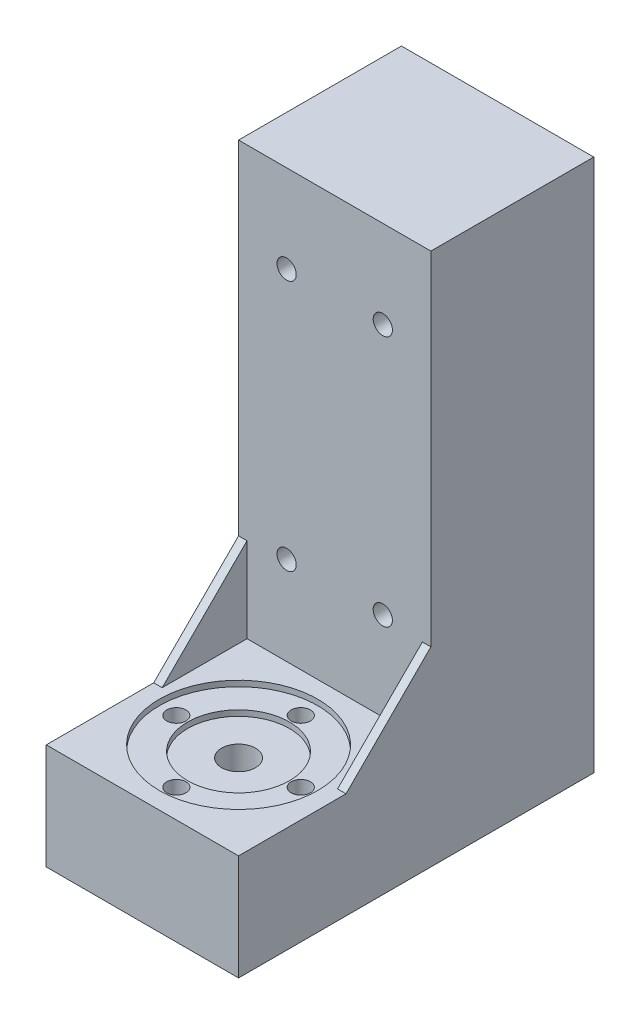
ISO-10303-21;
HEADER;
FILE_DESCRIPTION(('STEP AP214'),'2;1');
FILE_NAME('part.step','',(''),(''),'','','');
FILE_SCHEMA(('AUTOMOTIVE_DESIGN { 1 0 10303 214 1 1 1 1 }'));
ENDSEC;
DATA;
#1=APPLICATION_CONTEXT('core data for automotive mechanical design processes');
#2=APPLICATION_PROTOCOL_DEFINITION('international standard','automotive_design',2000,#1);
#3=PRODUCT_CONTEXT('',#1,'mechanical');
#4=PRODUCT('Part','Part','',(#3));
#5=PRODUCT_RELATED_PRODUCT_CATEGORY('part','',(#4));
#6=PRODUCT_DEFINITION_FORMATION('','',#4);
#7=PRODUCT_DEFINITION_CONTEXT('part definition',#1,'design');
#8=PRODUCT_DEFINITION('design','',#6,#7);
#9=PRODUCT_DEFINITION_SHAPE('','',#8);
#10=(LENGTH_UNIT() NAMED_UNIT(*) SI_UNIT(.MILLI.,.METRE.));
#11=(NAMED_UNIT(*) PLANE_ANGLE_UNIT() SI_UNIT($,.RADIAN.));
#12=(NAMED_UNIT(*) SI_UNIT($,.STERADIAN.) SOLID_ANGLE_UNIT());
#13=UNCERTAINTY_MEASURE_WITH_UNIT(LENGTH_MEASURE(1.E-05),#10,'distance_accuracy_value','');
#14=(GEOMETRIC_REPRESENTATION_CONTEXT(3) GLOBAL_UNCERTAINTY_ASSIGNED_CONTEXT((#13)) GLOBAL_UNIT_ASSIGNED_CONTEXT((#10,
#11,#12)) REPRESENTATION_CONTEXT('',''));
#15=CARTESIAN_POINT('',(0.,0.,0.));
#16=DIRECTION('',(0.,0.,1.));
#17=DIRECTION('',(1.,0.,0.));
#18=AXIS2_PLACEMENT_3D('',#15,#16,#17);
#19=CARTESIAN_POINT('',(-15.5,33.7,-34.));
#20=DIRECTION('',(0.,0.,-1.));
#21=DIRECTION('',(0.,1.,0.));
#22=AXIS2_PLACEMENT_3D('',#19,#20,#21);
#23=PLANE('',#22);
#24=DIRECTION('',(0.,-1.,0.));
#25=VECTOR('',#24,1.);
#26=CARTESIAN_POINT('',(-17.,33.7,-34.));
#27=LINE('',#26,#25);
#28=CARTESIAN_POINT('',(-17.,33.7,-34.));
#29=VERTEX_POINT('',#28);
#30=CARTESIAN_POINT('',(-17.,18.7,-34.));
#31=VERTEX_POINT('',#30);
#32=EDGE_CURVE('E110',#29,#31,#27,.T.);
#33=ORIENTED_EDGE('',*,*,#32,.F.);
#34=DIRECTION('',(-1.,0.,0.));
#35=VECTOR('',#34,1.);
#36=CARTESIAN_POINT('',(-15.5,33.7,-34.));
#37=LINE('',#36,#35);
#38=CARTESIAN_POINT('',(-15.5,33.7,-34.));
#39=VERTEX_POINT('',#38);
#40=EDGE_CURVE('E12',#39,#29,#37,.T.);
#41=ORIENTED_EDGE('',*,*,#40,.F.);
#42=DIRECTION('',(0.,-1.,0.));
#43=VECTOR('',#42,1.);
#44=CARTESIAN_POINT('',(-15.5,33.7,-34.));
#45=LINE('',#44,#43);
#46=CARTESIAN_POINT('',(-15.5,18.7,-34.));
#47=VERTEX_POINT('',#46);
#48=EDGE_CURVE('E97',#39,#47,#45,.T.);
#49=ORIENTED_EDGE('',*,*,#48,.T.);
#50=DIRECTION('',(-1.,0.,0.));
#51=VECTOR('',#50,1.);
#52=CARTESIAN_POINT('',(-15.5,18.7,-34.));
#53=LINE('',#52,#51);
#54=EDGE_CURVE('E59',#47,#31,#53,.T.);
#55=ORIENTED_EDGE('',*,*,#54,.T.);
#56=EDGE_LOOP('',(#33,#41,#49,#55));
#57=FACE_BOUND('',#56,.T.);
#58=ADVANCED_FACE('F54',(#57),#23,.T.);
#59=CARTESIAN_POINT('',(-15.5,18.7,-19.));
#60=DIRECTION('',(0.,0.707106781186547,0.707106781186548));
#61=DIRECTION('',(0.,-0.707106781186548,0.707106781186547));
#62=AXIS2_PLACEMENT_3D('',#59,#60,#61);
#63=PLANE('',#62);
#64=DIRECTION('',(0.,0.707106781186548,-0.707106781186547));
#65=VECTOR('',#64,1.);
#66=CARTESIAN_POINT('',(-17.,18.7,-19.));
#67=LINE('',#66,#65);
#68=CARTESIAN_POINT('',(-17.,18.7,-19.));
#69=VERTEX_POINT('',#68);
#70=EDGE_CURVE('E101',#69,#29,#67,.T.);
#71=ORIENTED_EDGE('',*,*,#70,.F.);
#72=DIRECTION('',(-1.,0.,0.));
#73=VECTOR('',#72,1.);
#74=CARTESIAN_POINT('',(-15.5,18.7,-19.));
#75=LINE('',#74,#73);
#76=CARTESIAN_POINT('',(-15.5,18.7,-19.));
#77=VERTEX_POINT('',#76);
#78=EDGE_CURVE('E62',#77,#69,#75,.T.);
#79=ORIENTED_EDGE('',*,*,#78,.F.);
#80=DIRECTION('',(0.,0.707106781186548,-0.707106781186547));
#81=VECTOR('',#80,1.);
#82=CARTESIAN_POINT('',(-15.5,18.7,-19.));
#83=LINE('',#82,#81);
#84=EDGE_CURVE('E96',#77,#39,#83,.T.);
#85=ORIENTED_EDGE('',*,*,#84,.T.);
#86=ORIENTED_EDGE('',*,*,#40,.T.);
#87=EDGE_LOOP('',(#71,#79,#85,#86));
#88=FACE_BOUND('',#87,.T.);
#89=ADVANCED_FACE('F112',(#88),#63,.T.);
#90=CARTESIAN_POINT('',(-15.5,18.7,-34.));
#91=DIRECTION('',(0.,-1.,0.));
#92=DIRECTION('',(0.,0.,-1.));
#93=AXIS2_PLACEMENT_3D('',#90,#91,#92);
#94=PLANE('',#93);
#95=DIRECTION('',(0.,0.,1.));
#96=VECTOR('',#95,1.);
#97=CARTESIAN_POINT('',(-17.,18.7,-34.));
#98=LINE('',#97,#96);
#99=EDGE_CURVE('E94',#31,#69,#98,.T.);
#100=ORIENTED_EDGE('',*,*,#99,.F.);
#101=ORIENTED_EDGE('',*,*,#54,.F.);
#102=DIRECTION('',(0.,0.,1.));
#103=VECTOR('',#102,1.);
#104=CARTESIAN_POINT('',(-15.5,18.7,-34.));
#105=LINE('',#104,#103);
#106=EDGE_CURVE('E95',#47,#77,#105,.T.);
#107=ORIENTED_EDGE('',*,*,#106,.T.);
#108=ORIENTED_EDGE('',*,*,#78,.T.);
#109=EDGE_LOOP('',(#100,#101,#107,#108));
#110=FACE_BOUND('',#109,.T.);
#111=ADVANCED_FACE('F93',(#110),#94,.T.);
#112=CARTESIAN_POINT('',(-15.5,0.,0.));
#113=DIRECTION('',(-1.,0.,0.));
#114=DIRECTION('',(0.,0.,1.));
#115=AXIS2_PLACEMENT_3D('',#112,#113,#114);
#116=PLANE('',#115);
#117=ORIENTED_EDGE('',*,*,#48,.F.);
#118=ORIENTED_EDGE('',*,*,#84,.F.);
#119=ORIENTED_EDGE('',*,*,#106,.F.);
#120=EDGE_LOOP('',(#117,#118,#119));
#121=FACE_BOUND('',#120,.T.);
#122=ADVANCED_FACE('F98',(#121),#116,.F.);
#123=CARTESIAN_POINT('',(-17.,0.,0.));
#124=DIRECTION('',(-1.,0.,0.));
#125=DIRECTION('',(0.,0.,1.));
#126=AXIS2_PLACEMENT_3D('',#123,#124,#125);
#127=PLANE('',#126);
#128=ORIENTED_EDGE('',*,*,#32,.T.);
#129=ORIENTED_EDGE('',*,*,#99,.T.);
#130=ORIENTED_EDGE('',*,*,#70,.T.);
#131=EDGE_LOOP('',(#128,#129,#130));
#132=FACE_BOUND('',#131,.T.);
#133=ADVANCED_FACE('F109',(#132),#127,.T.);
#134=CLOSED_SHELL('',(#58,#89,#111,#122,#133));
#135=MANIFOLD_SOLID_BREP('B2',#134);
#136=CARTESIAN_POINT('',(17.,18.7,-34.));
#137=DIRECTION('',(0.,-1.,0.));
#138=DIRECTION('',(0.,0.,-1.));
#139=AXIS2_PLACEMENT_3D('',#136,#137,#138);
#140=PLANE('',#139);
#141=CARTESIAN_POINT('',(0.,18.7,-17.));
#142=DIRECTION('',(0.,1.,0.));
#143=DIRECTION('',(0.,0.,1.));
#144=AXIS2_PLACEMENT_3D('',#141,#142,#143);
#145=CIRCLE('',#144,14.);
#146=CARTESIAN_POINT('',(0.,18.7,-2.99999999999999));
#147=VERTEX_POINT('',#146);
#148=EDGE_CURVE('E290',#147,#147,#145,.T.);
#149=ORIENTED_EDGE('',*,*,#148,.F.);
#150=EDGE_LOOP('',(#149));
#151=FACE_BOUND('',#150,.T.);
#152=DIRECTION('',(1.,0.,0.));
#153=VECTOR('',#152,1.);
#154=CARTESIAN_POINT('',(15.5,18.7,-19.));
#155=LINE('',#154,#153);
#156=CARTESIAN_POINT('',(15.5,18.7,-19.));
#157=VERTEX_POINT('',#156);
#158=CARTESIAN_POINT('',(17.,18.7,-19.));
#159=VERTEX_POINT('',#158);
#160=EDGE_CURVE('E367',#157,#159,#155,.T.);
#161=ORIENTED_EDGE('',*,*,#160,.F.);
#162=DIRECTION('',(0.,0.,-1.));
#163=VECTOR('',#162,1.);
#164=CARTESIAN_POINT('',(15.5,18.7,-19.));
#165=LINE('',#164,#163);
#166=CARTESIAN_POINT('',(15.5,18.7,-34.));
#167=VERTEX_POINT('',#166);
#168=EDGE_CURVE('E373',#157,#167,#165,.T.);
#169=ORIENTED_EDGE('',*,*,#168,.T.);
#170=DIRECTION('',(-1.,0.,0.));
#171=VECTOR('',#170,1.);
#172=CARTESIAN_POINT('',(17.,18.7,-34.));
#173=LINE('',#172,#171);
#174=CARTESIAN_POINT('',(-17.,18.7,-34.));
#175=VERTEX_POINT('',#174);
#176=EDGE_CURVE('E279',#167,#175,#173,.T.);
#177=ORIENTED_EDGE('',*,*,#176,.T.);
#178=DIRECTION('',(0.,0.,1.));
#179=VECTOR('',#178,1.);
#180=CARTESIAN_POINT('',(-17.,18.7,-34.));
#181=LINE('',#180,#179);
#182=CARTESIAN_POINT('',(-17.,18.7,0.));
#183=VERTEX_POINT('',#182);
#184=EDGE_CURVE('E210',#175,#183,#181,.T.);
#185=ORIENTED_EDGE('',*,*,#184,.T.);
#186=DIRECTION('',(-1.,0.,0.));
#187=VECTOR('',#186,1.);
#188=CARTESIAN_POINT('',(17.,18.7,0.));
#189=LINE('',#188,#187);
#190=CARTESIAN_POINT('',(17.,18.7,0.));
#191=VERTEX_POINT('',#190);
#192=EDGE_CURVE('E254',#191,#183,#189,.T.);
#193=ORIENTED_EDGE('',*,*,#192,.F.);
#194=DIRECTION('',(0.,0.,1.));
#195=VECTOR('',#194,1.);
#196=CARTESIAN_POINT('',(17.,18.7,-34.));
#197=LINE('',#196,#195);
#198=EDGE_CURVE('E179',#159,#191,#197,.T.);
#199=ORIENTED_EDGE('',*,*,#198,.F.);
#200=EDGE_LOOP('',(#161,#169,#177,#185,#193,#199));
#201=FACE_BOUND('',#200,.T.);
#202=ADVANCED_FACE('F153',(#151,#201),#140,.F.);
#203=CARTESIAN_POINT('',(17.,18.7,0.));
#204=DIRECTION('',(0.,0.,-1.));
#205=DIRECTION('',(-1.,0.,0.));
#206=AXIS2_PLACEMENT_3D('',#203,#204,#205);
#207=PLANE('',#206);
#208=DIRECTION('',(0.,-1.,0.));
#209=VECTOR('',#208,1.);
#210=CARTESIAN_POINT('',(-17.,18.7,0.));
#211=LINE('',#210,#209);
#212=CARTESIAN_POINT('',(-17.,0.,0.));
#213=VERTEX_POINT('',#212);
#214=EDGE_CURVE('E258',#183,#213,#211,.T.);
#215=ORIENTED_EDGE('',*,*,#214,.T.);
#216=DIRECTION('',(-1.,0.,0.));
#217=VECTOR('',#216,1.);
#218=CARTESIAN_POINT('',(17.,0.,0.));
#219=LINE('',#218,#217);
#220=CARTESIAN_POINT('',(17.,0.,0.));
#221=VERTEX_POINT('',#220);
#222=EDGE_CURVE('E52',#221,#213,#219,.T.);
#223=ORIENTED_EDGE('',*,*,#222,.F.);
#224=DIRECTION('',(0.,-1.,0.));
#225=VECTOR('',#224,1.);
#226=CARTESIAN_POINT('',(17.,18.7,0.));
#227=LINE('',#226,#225);
#228=EDGE_CURVE('E274',#191,#221,#227,.T.);
#229=ORIENTED_EDGE('',*,*,#228,.F.);
#230=ORIENTED_EDGE('',*,*,#192,.T.);
#231=EDGE_LOOP('',(#215,#223,#229,#230));
#232=FACE_BOUND('',#231,.T.);
#233=ADVANCED_FACE('F154',(#232),#207,.F.);
#234=CARTESIAN_POINT('',(17.,0.,0.));
#235=DIRECTION('',(0.,1.,0.));
#236=DIRECTION('',(0.,0.,1.));
#237=AXIS2_PLACEMENT_3D('',#234,#235,#236);
#238=PLANE('',#237);
#239=CARTESIAN_POINT('',(0.,0.,-6.00000000000001));
#240=DIRECTION('',(0.,1.,0.));
#241=DIRECTION('',(0.,0.,1.));
#242=AXIS2_PLACEMENT_3D('',#239,#240,#241);
#243=CIRCLE('',#242,1.7);
#244=CARTESIAN_POINT('',(0.,0.,-4.30000000000001));
#245=VERTEX_POINT('',#244);
#246=EDGE_CURVE('E305',#245,#245,#243,.T.);
#247=ORIENTED_EDGE('',*,*,#246,.T.);
#248=EDGE_LOOP('',(#247));
#249=FACE_BOUND('',#248,.T.);
#250=CARTESIAN_POINT('',(0.,0.,-17.));
#251=DIRECTION('',(0.,1.,0.));
#252=DIRECTION('',(0.,0.,1.));
#253=AXIS2_PLACEMENT_3D('',#250,#251,#252);
#254=CIRCLE('',#253,3.);
#255=CARTESIAN_POINT('',(0.,0.,-14.));
#256=VERTEX_POINT('',#255);
#257=EDGE_CURVE('E383',#256,#256,#254,.T.);
#258=ORIENTED_EDGE('',*,*,#257,.T.);
#259=EDGE_LOOP('',(#258));
#260=FACE_BOUND('',#259,.T.);
#261=CARTESIAN_POINT('',(-11.,0.,-17.));
#262=DIRECTION('',(0.,1.,0.));
#263=DIRECTION('',(0.,0.,1.));
#264=AXIS2_PLACEMENT_3D('',#261,#262,#263);
#265=CIRCLE('',#264,1.7);
#266=CARTESIAN_POINT('',(-11.,0.,-15.3));
#267=VERTEX_POINT('',#266);
#268=EDGE_CURVE('E397',#267,#267,#265,.T.);
#269=ORIENTED_EDGE('',*,*,#268,.T.);
#270=EDGE_LOOP('',(#269));
#271=FACE_BOUND('',#270,.T.);
#272=CARTESIAN_POINT('',(11.,0.,-17.));
#273=DIRECTION('',(0.,1.,0.));
#274=DIRECTION('',(0.,0.,1.));
#275=AXIS2_PLACEMENT_3D('',#272,#273,#274);
#276=CIRCLE('',#275,1.7);
#277=CARTESIAN_POINT('',(11.,0.,-15.3));
#278=VERTEX_POINT('',#277);
#279=EDGE_CURVE('E304',#278,#278,#276,.T.);
#280=ORIENTED_EDGE('',*,*,#279,.T.);
#281=EDGE_LOOP('',(#280));
#282=FACE_BOUND('',#281,.T.);
#283=CARTESIAN_POINT('',(0.,0.,-28.));
#284=DIRECTION('',(0.,1.,0.));
#285=DIRECTION('',(0.,0.,1.));
#286=AXIS2_PLACEMENT_3D('',#283,#284,#285);
#287=CIRCLE('',#286,1.7);
#288=CARTESIAN_POINT('',(0.,0.,-26.3));
#289=VERTEX_POINT('',#288);
#290=EDGE_CURVE('E406',#289,#289,#287,.T.);
#291=ORIENTED_EDGE('',*,*,#290,.T.);
#292=EDGE_LOOP('',(#291));
#293=FACE_BOUND('',#292,.T.);
#294=DIRECTION('',(0.,0.,-1.));
#295=VECTOR('',#294,1.);
#296=CARTESIAN_POINT('',(-17.,0.,0.));
#297=LINE('',#296,#295);
#298=CARTESIAN_POINT('',(-17.,0.,-62.8));
#299=VERTEX_POINT('',#298);
#300=EDGE_CURVE('E257',#213,#299,#297,.T.);
#301=ORIENTED_EDGE('',*,*,#300,.T.);
#302=DIRECTION('',(-1.,0.,0.));
#303=VECTOR('',#302,1.);
#304=CARTESIAN_POINT('',(17.,0.,-62.8));
#305=LINE('',#304,#303);
#306=CARTESIAN_POINT('',(17.,0.,-62.8));
#307=VERTEX_POINT('',#306);
#308=EDGE_CURVE('E162',#307,#299,#305,.T.);
#309=ORIENTED_EDGE('',*,*,#308,.F.);
#310=DIRECTION('',(0.,0.,-1.));
#311=VECTOR('',#310,1.);
#312=CARTESIAN_POINT('',(17.,0.,0.));
#313=LINE('',#312,#311);
#314=EDGE_CURVE('E214',#221,#307,#313,.T.);
#315=ORIENTED_EDGE('',*,*,#314,.F.);
#316=ORIENTED_EDGE('',*,*,#222,.T.);
#317=EDGE_LOOP('',(#301,#309,#315,#316));
#318=FACE_BOUND('',#317,.T.);
#319=ADVANCED_FACE('F350',(#249,#260,#271,#282,#293,#318),#238,.F.);
#320=CARTESIAN_POINT('',(17.,0.,-62.8));
#321=DIRECTION('',(0.,0.,1.));
#322=DIRECTION('',(1.,0.,0.));
#323=AXIS2_PLACEMENT_3D('',#320,#321,#322);
#324=PLANE('',#323);
#325=CARTESIAN_POINT('',(8.5,78.8,-62.8));
#326=DIRECTION('',(0.,0.,1.));
#327=DIRECTION('',(1.,0.,0.));
#328=AXIS2_PLACEMENT_3D('',#325,#326,#327);
#329=CIRCLE('',#328,1.7);
#330=CARTESIAN_POINT('',(10.2,78.8,-62.8));
#331=VERTEX_POINT('',#330);
#332=EDGE_CURVE('E322',#331,#331,#329,.T.);
#333=ORIENTED_EDGE('',*,*,#332,.T.);
#334=EDGE_LOOP('',(#333));
#335=FACE_BOUND('',#334,.T.);
#336=CARTESIAN_POINT('',(-8.49999999999999,34.35,-62.8));
#337=DIRECTION('',(0.,0.,1.));
#338=DIRECTION('',(-1.,0.,0.));
#339=AXIS2_PLACEMENT_3D('',#336,#337,#338);
#340=CIRCLE('',#339,1.7);
#341=CARTESIAN_POINT('',(-10.2,34.35,-62.8));
#342=VERTEX_POINT('',#341);
#343=EDGE_CURVE('E312',#342,#342,#340,.T.);
#344=ORIENTED_EDGE('',*,*,#343,.T.);
#345=EDGE_LOOP('',(#344));
#346=FACE_BOUND('',#345,.T.);
#347=CARTESIAN_POINT('',(-8.49999999999997,78.8,-62.8));
#348=DIRECTION('',(0.,0.,1.));
#349=DIRECTION('',(-1.,0.,0.));
#350=AXIS2_PLACEMENT_3D('',#347,#348,#349);
#351=CIRCLE('',#350,1.7);
#352=CARTESIAN_POINT('',(-10.2,78.8,-62.8));
#353=VERTEX_POINT('',#352);
#354=EDGE_CURVE('E310',#353,#353,#351,.T.);
#355=ORIENTED_EDGE('',*,*,#354,.T.);
#356=EDGE_LOOP('',(#355));
#357=FACE_BOUND('',#356,.T.);
#358=CARTESIAN_POINT('',(8.5,34.35,-62.8));
#359=DIRECTION('',(0.,0.,1.));
#360=DIRECTION('',(1.,0.,0.));
#361=AXIS2_PLACEMENT_3D('',#358,#359,#360);
#362=CIRCLE('',#361,1.7);
#363=CARTESIAN_POINT('',(10.2,34.35,-62.8));
#364=VERTEX_POINT('',#363);
#365=EDGE_CURVE('E261',#364,#364,#362,.T.);
#366=ORIENTED_EDGE('',*,*,#365,.T.);
#367=EDGE_LOOP('',(#366));
#368=FACE_BOUND('',#367,.T.);
#369=DIRECTION('',(0.,1.,0.));
#370=VECTOR('',#369,1.);
#371=CARTESIAN_POINT('',(-17.,0.,-62.8));
#372=LINE('',#371,#370);
#373=CARTESIAN_POINT('',(-17.,94.3,-62.8));
#374=VERTEX_POINT('',#373);
#375=EDGE_CURVE('E240',#299,#374,#372,.T.);
#376=ORIENTED_EDGE('',*,*,#375,.T.);
#377=DIRECTION('',(-1.,0.,0.));
#378=VECTOR('',#377,1.);
#379=CARTESIAN_POINT('',(17.,94.3,-62.8));
#380=LINE('',#379,#378);
#381=CARTESIAN_POINT('',(17.,94.3,-62.8));
#382=VERTEX_POINT('',#381);
#383=EDGE_CURVE('E233',#382,#374,#380,.T.);
#384=ORIENTED_EDGE('',*,*,#383,.F.);
#385=DIRECTION('',(0.,1.,0.));
#386=VECTOR('',#385,1.);
#387=CARTESIAN_POINT('',(17.,0.,-62.8));
#388=LINE('',#387,#386);
#389=EDGE_CURVE('E225',#307,#382,#388,.T.);
#390=ORIENTED_EDGE('',*,*,#389,.F.);
#391=ORIENTED_EDGE('',*,*,#308,.T.);
#392=EDGE_LOOP('',(#376,#384,#390,#391));
#393=FACE_BOUND('',#392,.T.);
#394=ADVANCED_FACE('F234',(#335,#346,#357,#368,#393),#324,.F.);
#395=CARTESIAN_POINT('',(17.,94.3,-62.8));
#396=DIRECTION('',(0.,-1.,0.));
#397=DIRECTION('',(0.,0.,-1.));
#398=AXIS2_PLACEMENT_3D('',#395,#396,#397);
#399=PLANE('',#398);
#400=DIRECTION('',(0.,0.,1.));
#401=VECTOR('',#400,1.);
#402=CARTESIAN_POINT('',(-17.,94.3,-62.8));
#403=LINE('',#402,#401);
#404=CARTESIAN_POINT('',(-17.,94.3,-34.));
#405=VERTEX_POINT('',#404);
#406=EDGE_CURVE('E266',#374,#405,#403,.T.);
#407=ORIENTED_EDGE('',*,*,#406,.T.);
#408=DIRECTION('',(-1.,0.,0.));
#409=VECTOR('',#408,1.);
#410=CARTESIAN_POINT('',(17.,94.3,-34.));
#411=LINE('',#410,#409);
#412=CARTESIAN_POINT('',(17.,94.3,-34.));
#413=VERTEX_POINT('',#412);
#414=EDGE_CURVE('E243',#413,#405,#411,.T.);
#415=ORIENTED_EDGE('',*,*,#414,.F.);
#416=DIRECTION('',(0.,0.,1.));
#417=VECTOR('',#416,1.);
#418=CARTESIAN_POINT('',(17.,94.3,-62.8));
#419=LINE('',#418,#417);
#420=EDGE_CURVE('E230',#382,#413,#419,.T.);
#421=ORIENTED_EDGE('',*,*,#420,.F.);
#422=ORIENTED_EDGE('',*,*,#383,.T.);
#423=EDGE_LOOP('',(#407,#415,#421,#422));
#424=FACE_BOUND('',#423,.T.);
#425=ADVANCED_FACE('F241',(#424),#399,.F.);
#426=CARTESIAN_POINT('',(17.,94.3,-34.));
#427=DIRECTION('',(0.,0.,-1.));
#428=DIRECTION('',(0.,1.,0.));
#429=AXIS2_PLACEMENT_3D('',#426,#427,#428);
#430=PLANE('',#429);
#431=CARTESIAN_POINT('',(8.5,78.8,-34.));
#432=DIRECTION('',(0.,0.,1.));
#433=DIRECTION('',(1.,0.,0.));
#434=AXIS2_PLACEMENT_3D('',#431,#432,#433);
#435=CIRCLE('',#434,1.7);
#436=CARTESIAN_POINT('',(10.2,78.8,-34.));
#437=VERTEX_POINT('',#436);
#438=EDGE_CURVE('E317',#437,#437,#435,.T.);
#439=ORIENTED_EDGE('',*,*,#438,.F.);
#440=EDGE_LOOP('',(#439));
#441=FACE_BOUND('',#440,.T.);
#442=CARTESIAN_POINT('',(-8.49999999999999,34.35,-34.));
#443=DIRECTION('',(0.,0.,1.));
#444=DIRECTION('',(-1.,0.,0.));
#445=AXIS2_PLACEMENT_3D('',#442,#443,#444);
#446=CIRCLE('',#445,1.7);
#447=CARTESIAN_POINT('',(-10.2,34.35,-34.));
#448=VERTEX_POINT('',#447);
#449=EDGE_CURVE('E327',#448,#448,#446,.T.);
#450=ORIENTED_EDGE('',*,*,#449,.F.);
#451=EDGE_LOOP('',(#450));
#452=FACE_BOUND('',#451,.T.);
#453=CARTESIAN_POINT('',(-8.49999999999997,78.8,-34.));
#454=DIRECTION('',(0.,0.,1.));
#455=DIRECTION('',(-1.,0.,0.));
#456=AXIS2_PLACEMENT_3D('',#453,#454,#455);
#457=CIRCLE('',#456,1.7);
#458=CARTESIAN_POINT('',(-10.2,78.8,-34.));
#459=VERTEX_POINT('',#458);
#460=EDGE_CURVE('E313',#459,#459,#457,.T.);
#461=ORIENTED_EDGE('',*,*,#460,.F.);
#462=EDGE_LOOP('',(#461));
#463=FACE_BOUND('',#462,.T.);
#464=CARTESIAN_POINT('',(8.5,34.35,-34.));
#465=DIRECTION('',(0.,0.,1.));
#466=DIRECTION('',(1.,0.,0.));
#467=AXIS2_PLACEMENT_3D('',#464,#465,#466);
#468=CIRCLE('',#467,1.7);
#469=CARTESIAN_POINT('',(10.2,34.35,-34.));
#470=VERTEX_POINT('',#469);
#471=EDGE_CURVE('E323',#470,#470,#468,.T.);
#472=ORIENTED_EDGE('',*,*,#471,.F.);
#473=EDGE_LOOP('',(#472));
#474=FACE_BOUND('',#473,.T.);
#475=ORIENTED_EDGE('',*,*,#176,.F.);
#476=DIRECTION('',(0.,1.,0.));
#477=VECTOR('',#476,1.);
#478=CARTESIAN_POINT('',(15.5,18.7,-34.));
#479=LINE('',#478,#477);
#480=CARTESIAN_POINT('',(15.5,33.7,-34.));
#481=VERTEX_POINT('',#480);
#482=EDGE_CURVE('E173',#167,#481,#479,.T.);
#483=ORIENTED_EDGE('',*,*,#482,.T.);
#484=DIRECTION('',(1.,0.,0.));
#485=VECTOR('',#484,1.);
#486=CARTESIAN_POINT('',(15.5,33.7,-34.));
#487=LINE('',#486,#485);
#488=CARTESIAN_POINT('',(17.,33.7,-34.));
#489=VERTEX_POINT('',#488);
#490=EDGE_CURVE('E360',#481,#489,#487,.T.);
#491=ORIENTED_EDGE('',*,*,#490,.T.);
#492=DIRECTION('',(0.,-1.,0.));
#493=VECTOR('',#492,1.);
#494=CARTESIAN_POINT('',(17.,94.3,-34.));
#495=LINE('',#494,#493);
#496=EDGE_CURVE('E250',#413,#489,#495,.T.);
#497=ORIENTED_EDGE('',*,*,#496,.F.);
#498=ORIENTED_EDGE('',*,*,#414,.T.);
#499=DIRECTION('',(0.,-1.,0.));
#500=VECTOR('',#499,1.);
#501=CARTESIAN_POINT('',(-17.,94.3,-34.));
#502=LINE('',#501,#500);
#503=EDGE_CURVE('E267',#405,#175,#502,.T.);
#504=ORIENTED_EDGE('',*,*,#503,.T.);
#505=EDGE_LOOP('',(#475,#483,#491,#497,#498,#504));
#506=FACE_BOUND('',#505,.T.);
#507=ADVANCED_FACE('F351',(#441,#452,#463,#474,#506),#430,.F.);
#508=CARTESIAN_POINT('',(17.,0.,0.));
#509=DIRECTION('',(1.,0.,0.));
#510=DIRECTION('',(0.,0.,-1.));
#511=AXIS2_PLACEMENT_3D('',#508,#509,#510);
#512=PLANE('',#511);
#513=ORIENTED_EDGE('',*,*,#496,.T.);
#514=DIRECTION('',(0.,-0.707106781186548,0.707106781186547));
#515=VECTOR('',#514,1.);
#516=CARTESIAN_POINT('',(17.,33.7,-34.));
#517=LINE('',#516,#515);
#518=EDGE_CURVE('E358',#489,#159,#517,.T.);
#519=ORIENTED_EDGE('',*,*,#518,.T.);
#520=ORIENTED_EDGE('',*,*,#198,.T.);
#521=ORIENTED_EDGE('',*,*,#228,.T.);
#522=ORIENTED_EDGE('',*,*,#314,.T.);
#523=ORIENTED_EDGE('',*,*,#389,.T.);
#524=ORIENTED_EDGE('',*,*,#420,.T.);
#525=EDGE_LOOP('',(#513,#519,#520,#521,#522,#523,#524));
#526=FACE_BOUND('',#525,.T.);
#527=ADVANCED_FACE('F223',(#526),#512,.T.);
#528=CARTESIAN_POINT('',(-17.,0.,0.));
#529=DIRECTION('',(1.,0.,0.));
#530=DIRECTION('',(0.,0.,-1.));
#531=AXIS2_PLACEMENT_3D('',#528,#529,#530);
#532=PLANE('',#531);
#533=ORIENTED_EDGE('',*,*,#214,.F.);
#534=ORIENTED_EDGE('',*,*,#184,.F.);
#535=ORIENTED_EDGE('',*,*,#503,.F.);
#536=ORIENTED_EDGE('',*,*,#406,.F.);
#537=ORIENTED_EDGE('',*,*,#375,.F.);
#538=ORIENTED_EDGE('',*,*,#300,.F.);
#539=EDGE_LOOP('',(#533,#534,#535,#536,#537,#538));
#540=FACE_BOUND('',#539,.T.);
#541=ADVANCED_FACE('F349',(#540),#532,.F.);
#542=CARTESIAN_POINT('',(8.5,34.35,-62.8));
#543=DIRECTION('',(0.,0.,1.));
#544=DIRECTION('',(1.,0.,0.));
#545=AXIS2_PLACEMENT_3D('',#542,#543,#544);
#546=CYLINDRICAL_SURFACE('',#545,1.7);
#547=ORIENTED_EDGE('',*,*,#365,.F.);
#548=EDGE_LOOP('',(#547));
#549=FACE_BOUND('',#548,.T.);
#550=ORIENTED_EDGE('',*,*,#471,.T.);
#551=EDGE_LOOP('',(#550));
#552=FACE_BOUND('',#551,.T.);
#553=ADVANCED_FACE('F497',(#549,#552),#546,.F.);
#554=CARTESIAN_POINT('',(-8.49999999999997,78.8,-62.8));
#555=DIRECTION('',(0.,0.,1.));
#556=DIRECTION('',(1.,0.,0.));
#557=AXIS2_PLACEMENT_3D('',#554,#555,#556);
#558=CYLINDRICAL_SURFACE('',#557,1.7);
#559=ORIENTED_EDGE('',*,*,#354,.F.);
#560=EDGE_LOOP('',(#559));
#561=FACE_BOUND('',#560,.T.);
#562=ORIENTED_EDGE('',*,*,#460,.T.);
#563=EDGE_LOOP('',(#562));
#564=FACE_BOUND('',#563,.T.);
#565=ADVANCED_FACE('F493',(#561,#564),#558,.F.);
#566=CARTESIAN_POINT('',(-8.49999999999999,34.35,-62.8));
#567=DIRECTION('',(0.,0.,1.));
#568=DIRECTION('',(1.,0.,0.));
#569=AXIS2_PLACEMENT_3D('',#566,#567,#568);
#570=CYLINDRICAL_SURFACE('',#569,1.7);
#571=ORIENTED_EDGE('',*,*,#343,.F.);
#572=EDGE_LOOP('',(#571));
#573=FACE_BOUND('',#572,.T.);
#574=ORIENTED_EDGE('',*,*,#449,.T.);
#575=EDGE_LOOP('',(#574));
#576=FACE_BOUND('',#575,.T.);
#577=ADVANCED_FACE('F487',(#573,#576),#570,.F.);
#578=CARTESIAN_POINT('',(8.5,78.8,-62.8));
#579=DIRECTION('',(0.,0.,1.));
#580=DIRECTION('',(1.,0.,0.));
#581=AXIS2_PLACEMENT_3D('',#578,#579,#580);
#582=CYLINDRICAL_SURFACE('',#581,1.7);
#583=ORIENTED_EDGE('',*,*,#332,.F.);
#584=EDGE_LOOP('',(#583));
#585=FACE_BOUND('',#584,.T.);
#586=ORIENTED_EDGE('',*,*,#438,.T.);
#587=EDGE_LOOP('',(#586));
#588=FACE_BOUND('',#587,.T.);
#589=ADVANCED_FACE('F482',(#585,#588),#582,.F.);
#590=CARTESIAN_POINT('',(0.,17.7,-17.));
#591=DIRECTION('',(0.,1.,0.));
#592=DIRECTION('',(0.,0.,1.));
#593=AXIS2_PLACEMENT_3D('',#590,#591,#592);
#594=CYLINDRICAL_SURFACE('',#593,14.);
#595=CARTESIAN_POINT('',(0.,17.7,-17.));
#596=DIRECTION('',(0.,1.,0.));
#597=DIRECTION('',(0.,0.,1.));
#598=AXIS2_PLACEMENT_3D('',#595,#596,#597);
#599=CIRCLE('',#598,14.);
#600=CARTESIAN_POINT('',(0.,17.7,-2.99999999999999));
#601=VERTEX_POINT('',#600);
#602=EDGE_CURVE('E294',#601,#601,#599,.T.);
#603=ORIENTED_EDGE('',*,*,#602,.F.);
#604=EDGE_LOOP('',(#603));
#605=FACE_BOUND('',#604,.T.);
#606=ORIENTED_EDGE('',*,*,#148,.T.);
#607=EDGE_LOOP('',(#606));
#608=FACE_BOUND('',#607,.T.);
#609=ADVANCED_FACE('F471',(#605,#608),#594,.F.);
#610=CARTESIAN_POINT('',(0.,17.7,-17.));
#611=DIRECTION('',(0.,1.,0.));
#612=DIRECTION('',(0.,0.,1.));
#613=AXIS2_PLACEMENT_3D('',#610,#611,#612);
#614=PLANE('',#613);
#615=CARTESIAN_POINT('',(0.,17.7,-6.00000000000001));
#616=DIRECTION('',(0.,1.,0.));
#617=DIRECTION('',(0.,0.,1.));
#618=AXIS2_PLACEMENT_3D('',#615,#616,#617);
#619=CIRCLE('',#618,1.7);
#620=CARTESIAN_POINT('',(0.,17.7,-4.30000000000001));
#621=VERTEX_POINT('',#620);
#622=EDGE_CURVE('E386',#621,#621,#619,.T.);
#623=ORIENTED_EDGE('',*,*,#622,.F.);
#624=EDGE_LOOP('',(#623));
#625=FACE_BOUND('',#624,.T.);
#626=CARTESIAN_POINT('',(-11.,17.7,-17.));
#627=DIRECTION('',(0.,1.,0.));
#628=DIRECTION('',(0.,0.,1.));
#629=AXIS2_PLACEMENT_3D('',#626,#627,#628);
#630=CIRCLE('',#629,1.7);
#631=CARTESIAN_POINT('',(-11.,17.7,-15.3));
#632=VERTEX_POINT('',#631);
#633=EDGE_CURVE('E392',#632,#632,#630,.T.);
#634=ORIENTED_EDGE('',*,*,#633,.F.);
#635=EDGE_LOOP('',(#634));
#636=FACE_BOUND('',#635,.T.);
#637=CARTESIAN_POINT('',(11.,17.7,-17.));
#638=DIRECTION('',(0.,1.,0.));
#639=DIRECTION('',(0.,0.,1.));
#640=AXIS2_PLACEMENT_3D('',#637,#638,#639);
#641=CIRCLE('',#640,1.7);
#642=CARTESIAN_POINT('',(11.,17.7,-15.3));
#643=VERTEX_POINT('',#642);
#644=EDGE_CURVE('E411',#643,#643,#641,.T.);
#645=ORIENTED_EDGE('',*,*,#644,.F.);
#646=EDGE_LOOP('',(#645));
#647=FACE_BOUND('',#646,.T.);
#648=CARTESIAN_POINT('',(0.,17.7,-28.));
#649=DIRECTION('',(0.,1.,0.));
#650=DIRECTION('',(0.,0.,1.));
#651=AXIS2_PLACEMENT_3D('',#648,#649,#650);
#652=CIRCLE('',#651,1.7);
#653=CARTESIAN_POINT('',(0.,17.7,-26.3));
#654=VERTEX_POINT('',#653);
#655=EDGE_CURVE('E391',#654,#654,#652,.T.);
#656=ORIENTED_EDGE('',*,*,#655,.F.);
#657=EDGE_LOOP('',(#656));
#658=FACE_BOUND('',#657,.T.);
#659=CARTESIAN_POINT('',(0.,17.7,-17.));
#660=DIRECTION('',(0.,1.,0.));
#661=DIRECTION('',(0.,0.,1.));
#662=AXIS2_PLACEMENT_3D('',#659,#660,#661);
#663=CIRCLE('',#662,9.);
#664=CARTESIAN_POINT('',(0.,17.7,-8.00000000000001));
#665=VERTEX_POINT('',#664);
#666=EDGE_CURVE('E282',#665,#665,#663,.T.);
#667=ORIENTED_EDGE('',*,*,#666,.F.);
#668=EDGE_LOOP('',(#667));
#669=FACE_BOUND('',#668,.T.);
#670=ORIENTED_EDGE('',*,*,#602,.T.);
#671=EDGE_LOOP('',(#670));
#672=FACE_BOUND('',#671,.T.);
#673=ADVANCED_FACE('F469',(#625,#636,#647,#658,#669,#672),#614,.T.);
#674=CARTESIAN_POINT('',(0.,16.7,-17.));
#675=DIRECTION('',(0.,1.,0.));
#676=DIRECTION('',(0.,0.,1.));
#677=AXIS2_PLACEMENT_3D('',#674,#675,#676);
#678=CYLINDRICAL_SURFACE('',#677,9.);
#679=ORIENTED_EDGE('',*,*,#666,.T.);
#680=EDGE_LOOP('',(#679));
#681=FACE_BOUND('',#680,.T.);
#682=CARTESIAN_POINT('',(0.,16.7,-17.));
#683=DIRECTION('',(0.,1.,0.));
#684=DIRECTION('',(0.,0.,1.));
#685=AXIS2_PLACEMENT_3D('',#682,#683,#684);
#686=CIRCLE('',#685,9.);
#687=CARTESIAN_POINT('',(0.,16.7,-8.00000000000001));
#688=VERTEX_POINT('',#687);
#689=EDGE_CURVE('E287',#688,#688,#686,.T.);
#690=ORIENTED_EDGE('',*,*,#689,.F.);
#691=EDGE_LOOP('',(#690));
#692=FACE_BOUND('',#691,.T.);
#693=ADVANCED_FACE('F472',(#681,#692),#678,.F.);
#694=CARTESIAN_POINT('',(0.,16.7,-17.));
#695=DIRECTION('',(0.,1.,0.));
#696=DIRECTION('',(0.,0.,1.));
#697=AXIS2_PLACEMENT_3D('',#694,#695,#696);
#698=PLANE('',#697);
#699=CARTESIAN_POINT('',(0.,16.7,-17.));
#700=DIRECTION('',(0.,1.,0.));
#701=DIRECTION('',(0.,0.,1.));
#702=AXIS2_PLACEMENT_3D('',#699,#700,#701);
#703=CIRCLE('',#702,3.);
#704=CARTESIAN_POINT('',(0.,16.7,-14.));
#705=VERTEX_POINT('',#704);
#706=EDGE_CURVE('E160',#705,#705,#703,.T.);
#707=ORIENTED_EDGE('',*,*,#706,.F.);
#708=EDGE_LOOP('',(#707));
#709=FACE_BOUND('',#708,.T.);
#710=ORIENTED_EDGE('',*,*,#689,.T.);
#711=EDGE_LOOP('',(#710));
#712=FACE_BOUND('',#711,.T.);
#713=ADVANCED_FACE('F557',(#709,#712),#698,.T.);
#714=CARTESIAN_POINT('',(0.,0.,-17.));
#715=DIRECTION('',(0.,1.,0.));
#716=DIRECTION('',(0.,0.,1.));
#717=AXIS2_PLACEMENT_3D('',#714,#715,#716);
#718=CYLINDRICAL_SURFACE('',#717,3.);
#719=ORIENTED_EDGE('',*,*,#706,.T.);
#720=EDGE_LOOP('',(#719));
#721=FACE_BOUND('',#720,.T.);
#722=ORIENTED_EDGE('',*,*,#257,.F.);
#723=EDGE_LOOP('',(#722));
#724=FACE_BOUND('',#723,.T.);
#725=ADVANCED_FACE('F432',(#721,#724),#718,.F.);
#726=CARTESIAN_POINT('',(0.,0.,-28.));
#727=DIRECTION('',(0.,1.,0.));
#728=DIRECTION('',(0.,0.,1.));
#729=AXIS2_PLACEMENT_3D('',#726,#727,#728);
#730=CYLINDRICAL_SURFACE('',#729,1.7);
#731=ORIENTED_EDGE('',*,*,#290,.F.);
#732=EDGE_LOOP('',(#731));
#733=FACE_BOUND('',#732,.T.);
#734=ORIENTED_EDGE('',*,*,#655,.T.);
#735=EDGE_LOOP('',(#734));
#736=FACE_BOUND('',#735,.T.);
#737=ADVANCED_FACE('F422',(#733,#736),#730,.F.);
#738=CARTESIAN_POINT('',(11.,0.,-17.));
#739=DIRECTION('',(0.,1.,0.));
#740=DIRECTION('',(0.,0.,1.));
#741=AXIS2_PLACEMENT_3D('',#738,#739,#740);
#742=CYLINDRICAL_SURFACE('',#741,1.7);
#743=ORIENTED_EDGE('',*,*,#279,.F.);
#744=EDGE_LOOP('',(#743));
#745=FACE_BOUND('',#744,.T.);
#746=ORIENTED_EDGE('',*,*,#644,.T.);
#747=EDGE_LOOP('',(#746));
#748=FACE_BOUND('',#747,.T.);
#749=ADVANCED_FACE('F425',(#745,#748),#742,.F.);
#750=CARTESIAN_POINT('',(-11.,0.,-17.));
#751=DIRECTION('',(0.,1.,0.));
#752=DIRECTION('',(0.,0.,1.));
#753=AXIS2_PLACEMENT_3D('',#750,#751,#752);
#754=CYLINDRICAL_SURFACE('',#753,1.7);
#755=ORIENTED_EDGE('',*,*,#268,.F.);
#756=EDGE_LOOP('',(#755));
#757=FACE_BOUND('',#756,.T.);
#758=ORIENTED_EDGE('',*,*,#633,.T.);
#759=EDGE_LOOP('',(#758));
#760=FACE_BOUND('',#759,.T.);
#761=ADVANCED_FACE('F424',(#757,#760),#754,.F.);
#762=CARTESIAN_POINT('',(0.,0.,-6.00000000000001));
#763=DIRECTION('',(0.,1.,0.));
#764=DIRECTION('',(0.,0.,1.));
#765=AXIS2_PLACEMENT_3D('',#762,#763,#764);
#766=CYLINDRICAL_SURFACE('',#765,1.7);
#767=ORIENTED_EDGE('',*,*,#246,.F.);
#768=EDGE_LOOP('',(#767));
#769=FACE_BOUND('',#768,.T.);
#770=ORIENTED_EDGE('',*,*,#622,.T.);
#771=EDGE_LOOP('',(#770));
#772=FACE_BOUND('',#771,.T.);
#773=ADVANCED_FACE('F431',(#769,#772),#766,.F.);
#774=CARTESIAN_POINT('',(15.5,33.7,-34.));
#775=DIRECTION('',(0.,0.707106781186547,0.707106781186548));
#776=DIRECTION('',(0.,-0.707106781186548,0.707106781186547));
#777=AXIS2_PLACEMENT_3D('',#774,#775,#776);
#778=PLANE('',#777);
#779=ORIENTED_EDGE('',*,*,#518,.F.);
#780=ORIENTED_EDGE('',*,*,#490,.F.);
#781=DIRECTION('',(0.,-0.707106781186548,0.707106781186547));
#782=VECTOR('',#781,1.);
#783=CARTESIAN_POINT('',(15.5,33.7,-34.));
#784=LINE('',#783,#782);
#785=EDGE_CURVE('E370',#481,#157,#784,.T.);
#786=ORIENTED_EDGE('',*,*,#785,.T.);
#787=ORIENTED_EDGE('',*,*,#160,.T.);
#788=EDGE_LOOP('',(#779,#780,#786,#787));
#789=FACE_BOUND('',#788,.T.);
#790=ADVANCED_FACE('F368',(#789),#778,.T.);
#791=CARTESIAN_POINT('',(15.5,0.,0.));
#792=DIRECTION('',(1.,0.,0.));
#793=DIRECTION('',(0.,0.,-1.));
#794=AXIS2_PLACEMENT_3D('',#791,#792,#793);
#795=PLANE('',#794);
#796=ORIENTED_EDGE('',*,*,#168,.F.);
#797=ORIENTED_EDGE('',*,*,#785,.F.);
#798=ORIENTED_EDGE('',*,*,#482,.F.);
#799=EDGE_LOOP('',(#796,#797,#798));
#800=FACE_BOUND('',#799,.T.);
#801=ADVANCED_FACE('F375',(#800),#795,.F.);
#802=CLOSED_SHELL('',(#202,#233,#319,#394,#425,#507,#527,#541,#553,#565,#577,#589,#609,#673,
#693,#713,#725,#737,#749,#761,#773,#790,#801));
#803=MANIFOLD_SOLID_BREP('B6',#802);
#804=ADVANCED_BREP_SHAPE_REPRESENTATION('',(#18,#135,#803),#14);
#805=SHAPE_DEFINITION_REPRESENTATION(#9,#804);
ENDSEC;
END-ISO-10303-21;
